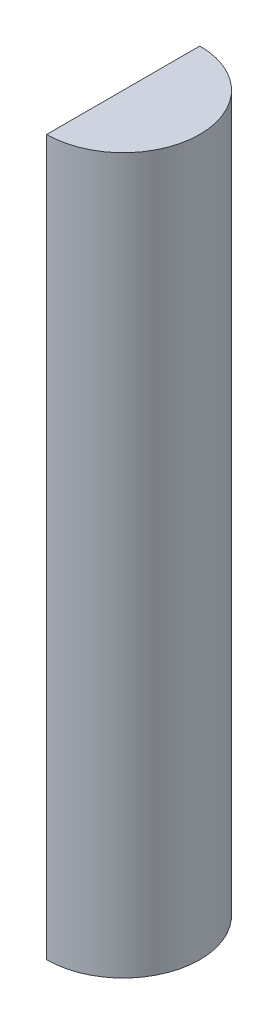
ISO-10303-21;
HEADER;
FILE_DESCRIPTION(('STEP AP214'),'2;1');
FILE_NAME('part.step','',(''),(''),'','','');
FILE_SCHEMA(('AUTOMOTIVE_DESIGN { 1 0 10303 214 1 1 1 1 }'));
ENDSEC;
DATA;
#1=APPLICATION_CONTEXT('core data for automotive mechanical design processes');
#2=APPLICATION_PROTOCOL_DEFINITION('international standard','automotive_design',2000,#1);
#3=PRODUCT_CONTEXT('',#1,'mechanical');
#4=PRODUCT('Part','Part','',(#3));
#5=PRODUCT_RELATED_PRODUCT_CATEGORY('part','',(#4));
#6=PRODUCT_DEFINITION_FORMATION('','',#4);
#7=PRODUCT_DEFINITION_CONTEXT('part definition',#1,'design');
#8=PRODUCT_DEFINITION('design','',#6,#7);
#9=PRODUCT_DEFINITION_SHAPE('','',#8);
#10=(LENGTH_UNIT() NAMED_UNIT(*) SI_UNIT(.MILLI.,.METRE.));
#11=(NAMED_UNIT(*) PLANE_ANGLE_UNIT() SI_UNIT($,.RADIAN.));
#12=(NAMED_UNIT(*) SI_UNIT($,.STERADIAN.) SOLID_ANGLE_UNIT());
#13=UNCERTAINTY_MEASURE_WITH_UNIT(LENGTH_MEASURE(1.E-05),#10,'distance_accuracy_value','');
#14=(GEOMETRIC_REPRESENTATION_CONTEXT(3) GLOBAL_UNCERTAINTY_ASSIGNED_CONTEXT((#13)) GLOBAL_UNIT_ASSIGNED_CONTEXT((#10,
#11,#12)) REPRESENTATION_CONTEXT('',''));
#15=CARTESIAN_POINT('',(0.,0.,0.));
#16=DIRECTION('',(0.,0.,1.));
#17=DIRECTION('',(1.,0.,0.));
#18=AXIS2_PLACEMENT_3D('',#15,#16,#17);
#19=CARTESIAN_POINT('',(0.,177.8,0.));
#20=DIRECTION('',(0.,-1.,0.));
#21=DIRECTION('',(0.,0.,-1.));
#22=AXIS2_PLACEMENT_3D('',#19,#20,#21);
#23=CYLINDRICAL_SURFACE('',#22,19.05);
#24=CARTESIAN_POINT('',(0.,0.,0.));
#25=DIRECTION('',(0.,1.,0.));
#26=DIRECTION('',(0.,0.,1.));
#27=AXIS2_PLACEMENT_3D('',#24,#25,#26);
#28=CIRCLE('',#27,19.05);
#29=CARTESIAN_POINT('',(0.,0.,19.05));
#30=VERTEX_POINT('',#29);
#31=CARTESIAN_POINT('',(0.,0.,-19.05));
#32=VERTEX_POINT('',#31);
#33=EDGE_CURVE('E66',#30,#32,#28,.T.);
#34=ORIENTED_EDGE('',*,*,#33,.T.);
#35=DIRECTION('',(0.,-1.,0.));
#36=VECTOR('',#35,1.);
#37=CARTESIAN_POINT('',(0.,177.8,-19.05));
#38=LINE('',#37,#36);
#39=CARTESIAN_POINT('',(0.,177.8,-19.05));
#40=VERTEX_POINT('',#39);
#41=EDGE_CURVE('E11',#40,#32,#38,.T.);
#42=ORIENTED_EDGE('',*,*,#41,.F.);
#43=CARTESIAN_POINT('',(0.,177.8,0.));
#44=DIRECTION('',(0.,1.,0.));
#45=DIRECTION('',(0.,0.,1.));
#46=AXIS2_PLACEMENT_3D('',#43,#44,#45);
#47=CIRCLE('',#46,19.05);
#48=CARTESIAN_POINT('',(0.,177.8,19.05));
#49=VERTEX_POINT('',#48);
#50=EDGE_CURVE('E65',#49,#40,#47,.T.);
#51=ORIENTED_EDGE('',*,*,#50,.F.);
#52=DIRECTION('',(0.,-1.,0.));
#53=VECTOR('',#52,1.);
#54=CARTESIAN_POINT('',(0.,177.8,19.05));
#55=LINE('',#54,#53);
#56=EDGE_CURVE('E43',#49,#30,#55,.T.);
#57=ORIENTED_EDGE('',*,*,#56,.T.);
#58=EDGE_LOOP('',(#34,#42,#51,#57));
#59=FACE_BOUND('',#58,.T.);
#60=ADVANCED_FACE('F35',(#59),#23,.T.);
#61=CARTESIAN_POINT('',(0.,177.8,-19.05));
#62=DIRECTION('',(1.,0.,0.));
#63=DIRECTION('',(0.,0.,-1.));
#64=AXIS2_PLACEMENT_3D('',#61,#62,#63);
#65=PLANE('',#64);
#66=DIRECTION('',(0.,0.,1.));
#67=VECTOR('',#66,1.);
#68=CARTESIAN_POINT('',(0.,0.,-19.05));
#69=LINE('',#68,#67);
#70=EDGE_CURVE('E58',#32,#30,#69,.T.);
#71=ORIENTED_EDGE('',*,*,#70,.T.);
#72=ORIENTED_EDGE('',*,*,#56,.F.);
#73=DIRECTION('',(0.,0.,1.));
#74=VECTOR('',#73,1.);
#75=CARTESIAN_POINT('',(0.,177.8,-19.05));
#76=LINE('',#75,#74);
#77=EDGE_CURVE('E50',#40,#49,#76,.T.);
#78=ORIENTED_EDGE('',*,*,#77,.F.);
#79=ORIENTED_EDGE('',*,*,#41,.T.);
#80=EDGE_LOOP('',(#71,#72,#78,#79));
#81=FACE_BOUND('',#80,.T.);
#82=ADVANCED_FACE('F61',(#81),#65,.F.);
#83=CARTESIAN_POINT('',(0.,177.8,0.));
#84=DIRECTION('',(0.,1.,0.));
#85=DIRECTION('',(0.,0.,1.));
#86=AXIS2_PLACEMENT_3D('',#83,#84,#85);
#87=PLANE('',#86);
#88=ORIENTED_EDGE('',*,*,#50,.T.);
#89=ORIENTED_EDGE('',*,*,#77,.T.);
#90=EDGE_LOOP('',(#88,#89));
#91=FACE_BOUND('',#90,.T.);
#92=ADVANCED_FACE('F73',(#91),#87,.T.);
#93=CARTESIAN_POINT('',(0.,0.,0.));
#94=DIRECTION('',(0.,1.,0.));
#95=DIRECTION('',(0.,0.,1.));
#96=AXIS2_PLACEMENT_3D('',#93,#94,#95);
#97=PLANE('',#96);
#98=ORIENTED_EDGE('',*,*,#33,.F.);
#99=ORIENTED_EDGE('',*,*,#70,.F.);
#100=EDGE_LOOP('',(#98,#99));
#101=FACE_BOUND('',#100,.T.);
#102=ADVANCED_FACE('F69',(#101),#97,.F.);
#103=CLOSED_SHELL('',(#60,#82,#92,#102));
#104=MANIFOLD_SOLID_BREP('B2',#103);
#105=ADVANCED_BREP_SHAPE_REPRESENTATION('',(#18,#104),#14);
#106=SHAPE_DEFINITION_REPRESENTATION(#9,#105);
ENDSEC;
END-ISO-10303-21;
